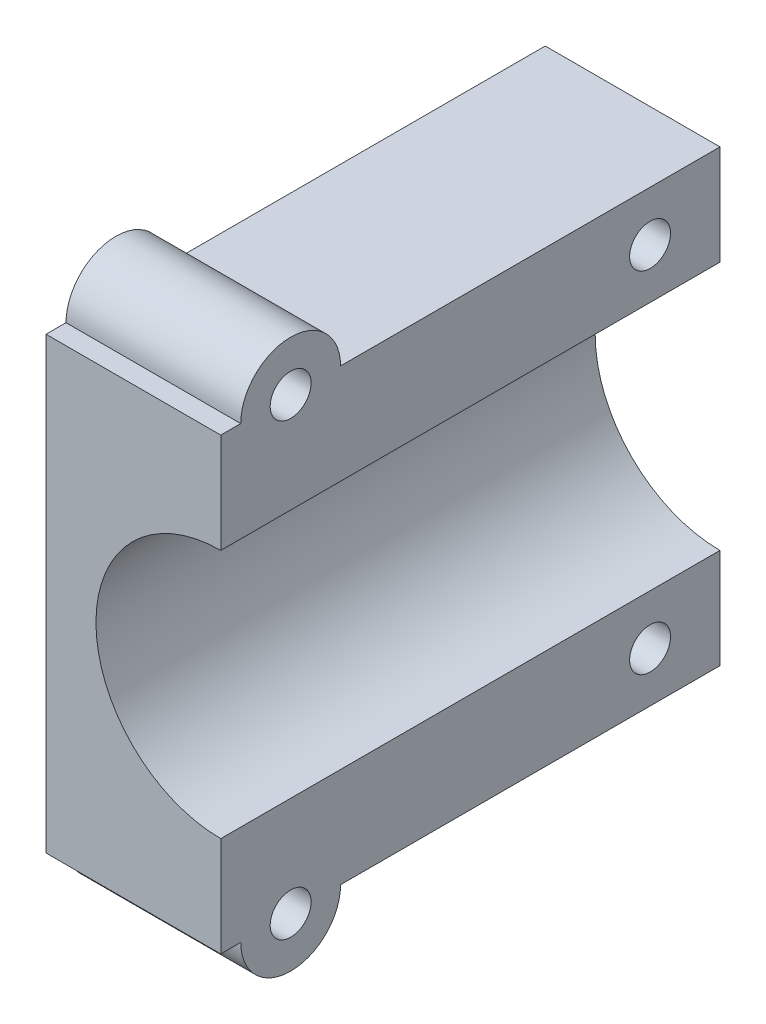
ISO-10303-21;
HEADER;
FILE_DESCRIPTION(('STEP AP214'),'2;1');
FILE_NAME('part.step','',(''),(''),'','','');
FILE_SCHEMA(('AUTOMOTIVE_DESIGN { 1 0 10303 214 1 1 1 1 }'));
ENDSEC;
DATA;
#1=APPLICATION_CONTEXT('core data for automotive mechanical design processes');
#2=APPLICATION_PROTOCOL_DEFINITION('international standard','automotive_design',2000,#1);
#3=PRODUCT_CONTEXT('',#1,'mechanical');
#4=PRODUCT('Part','Part','',(#3));
#5=PRODUCT_RELATED_PRODUCT_CATEGORY('part','',(#4));
#6=PRODUCT_DEFINITION_FORMATION('','',#4);
#7=PRODUCT_DEFINITION_CONTEXT('part definition',#1,'design');
#8=PRODUCT_DEFINITION('design','',#6,#7);
#9=PRODUCT_DEFINITION_SHAPE('','',#8);
#10=(LENGTH_UNIT() NAMED_UNIT(*) SI_UNIT(.MILLI.,.METRE.));
#11=(NAMED_UNIT(*) PLANE_ANGLE_UNIT() SI_UNIT($,.RADIAN.));
#12=(NAMED_UNIT(*) SI_UNIT($,.STERADIAN.) SOLID_ANGLE_UNIT());
#13=UNCERTAINTY_MEASURE_WITH_UNIT(LENGTH_MEASURE(1.E-05),#10,'distance_accuracy_value','');
#14=(GEOMETRIC_REPRESENTATION_CONTEXT(3) GLOBAL_UNCERTAINTY_ASSIGNED_CONTEXT((#13)) GLOBAL_UNIT_ASSIGNED_CONTEXT((#10,
#11,#12)) REPRESENTATION_CONTEXT('',''));
#15=CARTESIAN_POINT('',(0.,0.,0.));
#16=DIRECTION('',(0.,0.,1.));
#17=DIRECTION('',(1.,0.,0.));
#18=AXIS2_PLACEMENT_3D('',#15,#16,#17);
#19=CARTESIAN_POINT('',(-17.5,45.,25.));
#20=DIRECTION('',(0.,1.,0.));
#21=DIRECTION('',(0.,0.,1.));
#22=AXIS2_PLACEMENT_3D('',#19,#20,#21);
#23=PLANE('',#22);
#24=DIRECTION('',(0.,0.,-1.));
#25=VECTOR('',#24,1.);
#26=CARTESIAN_POINT('',(-17.5,45.,25.));
#27=LINE('',#26,#25);
#28=CARTESIAN_POINT('',(-17.5,45.,13.));
#29=VERTEX_POINT('',#28);
#30=CARTESIAN_POINT('',(-17.5,45.,-25.));
#31=VERTEX_POINT('',#30);
#32=EDGE_CURVE('E125',#29,#31,#27,.T.);
#33=ORIENTED_EDGE('',*,*,#32,.F.);
#34=DIRECTION('',(-1.,0.,0.));
#35=VECTOR('',#34,1.);
#36=CARTESIAN_POINT('',(0.,45.,13.));
#37=LINE('',#36,#35);
#38=CARTESIAN_POINT('',(0.,45.,13.));
#39=VERTEX_POINT('',#38);
#40=EDGE_CURVE('E112',#39,#29,#37,.T.);
#41=ORIENTED_EDGE('',*,*,#40,.F.);
#42=DIRECTION('',(0.,0.,1.));
#43=VECTOR('',#42,1.);
#44=CARTESIAN_POINT('',(0.,45.,-25.));
#45=LINE('',#44,#43);
#46=CARTESIAN_POINT('',(0.,45.,-25.));
#47=VERTEX_POINT('',#46);
#48=EDGE_CURVE('E123',#47,#39,#45,.T.);
#49=ORIENTED_EDGE('',*,*,#48,.F.);
#50=DIRECTION('',(1.,0.,0.));
#51=VECTOR('',#50,1.);
#52=CARTESIAN_POINT('',(-17.5,45.,-25.));
#53=LINE('',#52,#51);
#54=EDGE_CURVE('E154',#31,#47,#53,.T.);
#55=ORIENTED_EDGE('',*,*,#54,.F.);
#56=EDGE_LOOP('',(#33,#41,#49,#55));
#57=FACE_BOUND('',#56,.T.);
#58=ADVANCED_FACE('F34',(#57),#23,.T.);
#59=CARTESIAN_POINT('',(0.,45.,23.));
#60=VERTEX_POINT('',#59);
#61=CARTESIAN_POINT('',(0.,45.,25.));
#62=VERTEX_POINT('',#61);
#63=EDGE_CURVE('E131',#60,#62,#45,.T.);
#64=ORIENTED_EDGE('',*,*,#63,.F.);
#65=DIRECTION('',(-1.,0.,0.));
#66=VECTOR('',#65,1.);
#67=CARTESIAN_POINT('',(0.,45.,23.));
#68=LINE('',#67,#66);
#69=CARTESIAN_POINT('',(-17.5,45.,23.));
#70=VERTEX_POINT('',#69);
#71=EDGE_CURVE('E50',#60,#70,#68,.T.);
#72=ORIENTED_EDGE('',*,*,#71,.T.);
#73=CARTESIAN_POINT('',(-17.5,45.,25.));
#74=VERTEX_POINT('',#73);
#75=EDGE_CURVE('E159',#74,#70,#27,.T.);
#76=ORIENTED_EDGE('',*,*,#75,.F.);
#77=DIRECTION('',(1.,0.,0.));
#78=VECTOR('',#77,1.);
#79=CARTESIAN_POINT('',(-17.5,45.,25.));
#80=LINE('',#79,#78);
#81=EDGE_CURVE('E155',#74,#62,#80,.T.);
#82=ORIENTED_EDGE('',*,*,#81,.T.);
#83=EDGE_LOOP('',(#64,#72,#76,#82));
#84=FACE_BOUND('',#83,.T.);
#85=ADVANCED_FACE('F230',(#84),#23,.T.);
#86=CARTESIAN_POINT('',(-17.5,0.,25.));
#87=DIRECTION('',(0.,1.,0.));
#88=DIRECTION('',(0.,0.,1.));
#89=AXIS2_PLACEMENT_3D('',#86,#87,#88);
#90=PLANE('',#89);
#91=DIRECTION('',(0.,0.,-1.));
#92=VECTOR('',#91,1.);
#93=CARTESIAN_POINT('',(0.,0.,-25.));
#94=LINE('',#93,#92);
#95=CARTESIAN_POINT('',(0.,0.,13.));
#96=VERTEX_POINT('',#95);
#97=CARTESIAN_POINT('',(0.,0.,-25.));
#98=VERTEX_POINT('',#97);
#99=EDGE_CURVE('E130',#96,#98,#94,.T.);
#100=ORIENTED_EDGE('',*,*,#99,.F.);
#101=DIRECTION('',(-1.,0.,0.));
#102=VECTOR('',#101,1.);
#103=CARTESIAN_POINT('',(0.,0.,13.));
#104=LINE('',#103,#102);
#105=CARTESIAN_POINT('',(-17.5,0.,13.));
#106=VERTEX_POINT('',#105);
#107=EDGE_CURVE('E190',#96,#106,#104,.T.);
#108=ORIENTED_EDGE('',*,*,#107,.T.);
#109=DIRECTION('',(0.,0.,-1.));
#110=VECTOR('',#109,1.);
#111=CARTESIAN_POINT('',(-17.5,0.,25.));
#112=LINE('',#111,#110);
#113=CARTESIAN_POINT('',(-17.5,0.,-25.));
#114=VERTEX_POINT('',#113);
#115=EDGE_CURVE('E43',#106,#114,#112,.T.);
#116=ORIENTED_EDGE('',*,*,#115,.T.);
#117=DIRECTION('',(1.,0.,0.));
#118=VECTOR('',#117,1.);
#119=CARTESIAN_POINT('',(-17.5,0.,-25.));
#120=LINE('',#119,#118);
#121=EDGE_CURVE('E177',#114,#98,#120,.T.);
#122=ORIENTED_EDGE('',*,*,#121,.T.);
#123=EDGE_LOOP('',(#100,#108,#116,#122));
#124=FACE_BOUND('',#123,.T.);
#125=ADVANCED_FACE('F235',(#124),#90,.F.);
#126=CARTESIAN_POINT('',(-17.5,22.5,25.));
#127=DIRECTION('',(1.,0.,0.));
#128=DIRECTION('',(0.,0.,-1.));
#129=AXIS2_PLACEMENT_3D('',#126,#127,#128);
#130=PLANE('',#129);
#131=CARTESIAN_POINT('',(-17.5,45.,18.));
#132=DIRECTION('',(1.,0.,0.));
#133=DIRECTION('',(0.,1.,0.));
#134=AXIS2_PLACEMENT_3D('',#131,#132,#133);
#135=CIRCLE('',#134,2.05);
#136=CARTESIAN_POINT('',(-17.5,47.05,18.));
#137=VERTEX_POINT('',#136);
#138=EDGE_CURVE('E213',#137,#137,#135,.T.);
#139=ORIENTED_EDGE('',*,*,#138,.T.);
#140=EDGE_LOOP('',(#139));
#141=FACE_BOUND('',#140,.T.);
#142=CARTESIAN_POINT('',(-17.5,0.,18.));
#143=DIRECTION('',(-1.,0.,0.));
#144=DIRECTION('',(0.,-1.,0.));
#145=AXIS2_PLACEMENT_3D('',#142,#143,#144);
#146=CIRCLE('',#145,2.05);
#147=CARTESIAN_POINT('',(-17.5,-2.05,18.));
#148=VERTEX_POINT('',#147);
#149=EDGE_CURVE('E205',#148,#148,#146,.T.);
#150=ORIENTED_EDGE('',*,*,#149,.F.);
#151=EDGE_LOOP('',(#150));
#152=FACE_BOUND('',#151,.T.);
#153=CARTESIAN_POINT('',(-17.5,40.,-18.));
#154=DIRECTION('',(1.,0.,0.));
#155=DIRECTION('',(0.,0.,1.));
#156=AXIS2_PLACEMENT_3D('',#153,#154,#155);
#157=CIRCLE('',#156,2.05);
#158=CARTESIAN_POINT('',(-17.5,40.,-15.95));
#159=VERTEX_POINT('',#158);
#160=EDGE_CURVE('E151',#159,#159,#157,.T.);
#161=ORIENTED_EDGE('',*,*,#160,.T.);
#162=EDGE_LOOP('',(#161));
#163=FACE_BOUND('',#162,.T.);
#164=CARTESIAN_POINT('',(-17.5,5.,-18.));
#165=DIRECTION('',(-1.,0.,0.));
#166=DIRECTION('',(0.,0.,1.));
#167=AXIS2_PLACEMENT_3D('',#164,#165,#166);
#168=CIRCLE('',#167,2.05);
#169=CARTESIAN_POINT('',(-17.5,5.,-15.95));
#170=VERTEX_POINT('',#169);
#171=EDGE_CURVE('E162',#170,#170,#168,.T.);
#172=ORIENTED_EDGE('',*,*,#171,.F.);
#173=EDGE_LOOP('',(#172));
#174=FACE_BOUND('',#173,.T.);
#175=DIRECTION('',(0.,-1.,0.));
#176=VECTOR('',#175,1.);
#177=CARTESIAN_POINT('',(-17.5,22.5,-25.));
#178=LINE('',#177,#176);
#179=EDGE_CURVE('E165',#31,#114,#178,.T.);
#180=ORIENTED_EDGE('',*,*,#179,.T.);
#181=ORIENTED_EDGE('',*,*,#115,.F.);
#182=CARTESIAN_POINT('',(-17.5,0.,18.));
#183=DIRECTION('',(-1.,0.,0.));
#184=DIRECTION('',(0.,-1.,0.));
#185=AXIS2_PLACEMENT_3D('',#182,#183,#184);
#186=CIRCLE('',#185,5.);
#187=CARTESIAN_POINT('',(-17.5,0.,23.));
#188=VERTEX_POINT('',#187);
#189=EDGE_CURVE('E198',#106,#188,#186,.T.);
#190=ORIENTED_EDGE('',*,*,#189,.T.);
#191=CARTESIAN_POINT('',(-17.5,0.,25.));
#192=VERTEX_POINT('',#191);
#193=EDGE_CURVE('E11',#192,#188,#112,.T.);
#194=ORIENTED_EDGE('',*,*,#193,.F.);
#195=DIRECTION('',(0.,-1.,0.));
#196=VECTOR('',#195,1.);
#197=CARTESIAN_POINT('',(-17.5,22.5,25.));
#198=LINE('',#197,#196);
#199=EDGE_CURVE('E166',#74,#192,#198,.T.);
#200=ORIENTED_EDGE('',*,*,#199,.F.);
#201=ORIENTED_EDGE('',*,*,#75,.T.);
#202=CARTESIAN_POINT('',(-17.5,45.,18.));
#203=DIRECTION('',(1.,0.,0.));
#204=DIRECTION('',(0.,1.,0.));
#205=AXIS2_PLACEMENT_3D('',#202,#203,#204);
#206=CIRCLE('',#205,5.);
#207=EDGE_CURVE('E117',#29,#70,#206,.T.);
#208=ORIENTED_EDGE('',*,*,#207,.F.);
#209=ORIENTED_EDGE('',*,*,#32,.T.);
#210=EDGE_LOOP('',(#180,#181,#190,#194,#200,#201,#208,#209));
#211=FACE_BOUND('',#210,.T.);
#212=ADVANCED_FACE('F36',(#141,#152,#163,#174,#211),#130,.F.);
#213=ORIENTED_EDGE('',*,*,#193,.T.);
#214=DIRECTION('',(-1.,0.,0.));
#215=VECTOR('',#214,1.);
#216=CARTESIAN_POINT('',(0.,0.,23.));
#217=LINE('',#216,#215);
#218=CARTESIAN_POINT('',(0.,0.,23.));
#219=VERTEX_POINT('',#218);
#220=EDGE_CURVE('E192',#219,#188,#217,.T.);
#221=ORIENTED_EDGE('',*,*,#220,.F.);
#222=CARTESIAN_POINT('',(0.,0.,25.));
#223=VERTEX_POINT('',#222);
#224=EDGE_CURVE('E133',#223,#219,#94,.T.);
#225=ORIENTED_EDGE('',*,*,#224,.F.);
#226=DIRECTION('',(1.,0.,0.));
#227=VECTOR('',#226,1.);
#228=CARTESIAN_POINT('',(-17.5,0.,25.));
#229=LINE('',#228,#227);
#230=EDGE_CURVE('E168',#192,#223,#229,.T.);
#231=ORIENTED_EDGE('',*,*,#230,.F.);
#232=EDGE_LOOP('',(#213,#221,#225,#231));
#233=FACE_BOUND('',#232,.T.);
#234=ADVANCED_FACE('F252',(#233),#90,.F.);
#235=CARTESIAN_POINT('',(0.,22.5,25.));
#236=DIRECTION('',(0.,0.,-1.));
#237=DIRECTION('',(-1.,0.,0.));
#238=AXIS2_PLACEMENT_3D('',#235,#236,#237);
#239=CYLINDRICAL_SURFACE('',#238,12.5);
#240=CARTESIAN_POINT('',(0.,22.5,-25.));
#241=DIRECTION('',(0.,0.,-1.));
#242=DIRECTION('',(1.,0.,0.));
#243=AXIS2_PLACEMENT_3D('',#240,#241,#242);
#244=CIRCLE('',#243,12.5);
#245=CARTESIAN_POINT('',(0.,10.,-25.));
#246=VERTEX_POINT('',#245);
#247=CARTESIAN_POINT('',(0.,35.,-25.));
#248=VERTEX_POINT('',#247);
#249=EDGE_CURVE('E169',#246,#248,#244,.T.);
#250=ORIENTED_EDGE('',*,*,#249,.T.);
#251=DIRECTION('',(0.,0.,-1.));
#252=VECTOR('',#251,1.);
#253=CARTESIAN_POINT('',(0.,35.,25.));
#254=LINE('',#253,#252);
#255=CARTESIAN_POINT('',(0.,35.,25.));
#256=VERTEX_POINT('',#255);
#257=EDGE_CURVE('E148',#248,#256,#254,.F.);
#258=ORIENTED_EDGE('',*,*,#257,.T.);
#259=CARTESIAN_POINT('',(0.,22.5,25.));
#260=DIRECTION('',(0.,0.,-1.));
#261=DIRECTION('',(1.,0.,0.));
#262=AXIS2_PLACEMENT_3D('',#259,#260,#261);
#263=CIRCLE('',#262,12.5);
#264=CARTESIAN_POINT('',(0.,10.,25.));
#265=VERTEX_POINT('',#264);
#266=EDGE_CURVE('E172',#265,#256,#263,.T.);
#267=ORIENTED_EDGE('',*,*,#266,.F.);
#268=DIRECTION('',(0.,0.,-1.));
#269=VECTOR('',#268,1.);
#270=CARTESIAN_POINT('',(0.,10.,25.));
#271=LINE('',#270,#269);
#272=EDGE_CURVE('E144',#265,#246,#271,.T.);
#273=ORIENTED_EDGE('',*,*,#272,.T.);
#274=EDGE_LOOP('',(#250,#258,#267,#273));
#275=FACE_BOUND('',#274,.T.);
#276=ADVANCED_FACE('F183',(#275),#239,.F.);
#277=CARTESIAN_POINT('',(0.,22.5,25.));
#278=DIRECTION('',(0.,0.,1.));
#279=DIRECTION('',(1.,0.,0.));
#280=AXIS2_PLACEMENT_3D('',#277,#278,#279);
#281=PLANE('',#280);
#282=DIRECTION('',(0.,-1.,0.));
#283=VECTOR('',#282,1.);
#284=CARTESIAN_POINT('',(0.,22.5,25.));
#285=LINE('',#284,#283);
#286=EDGE_CURVE('E145',#62,#256,#285,.T.);
#287=ORIENTED_EDGE('',*,*,#286,.F.);
#288=ORIENTED_EDGE('',*,*,#81,.F.);
#289=ORIENTED_EDGE('',*,*,#199,.T.);
#290=ORIENTED_EDGE('',*,*,#230,.T.);
#291=EDGE_CURVE('E142',#265,#223,#285,.T.);
#292=ORIENTED_EDGE('',*,*,#291,.F.);
#293=ORIENTED_EDGE('',*,*,#266,.T.);
#294=EDGE_LOOP('',(#287,#288,#289,#290,#292,#293));
#295=FACE_BOUND('',#294,.T.);
#296=ADVANCED_FACE('F245',(#295),#281,.T.);
#297=CARTESIAN_POINT('',(0.,22.5,-25.));
#298=DIRECTION('',(0.,0.,1.));
#299=DIRECTION('',(1.,0.,0.));
#300=AXIS2_PLACEMENT_3D('',#297,#298,#299);
#301=PLANE('',#300);
#302=ORIENTED_EDGE('',*,*,#54,.T.);
#303=DIRECTION('',(0.,1.,0.));
#304=VECTOR('',#303,1.);
#305=CARTESIAN_POINT('',(0.,45.,-25.));
#306=LINE('',#305,#304);
#307=EDGE_CURVE('E129',#248,#47,#306,.T.);
#308=ORIENTED_EDGE('',*,*,#307,.F.);
#309=ORIENTED_EDGE('',*,*,#249,.F.);
#310=EDGE_CURVE('E135',#98,#246,#306,.T.);
#311=ORIENTED_EDGE('',*,*,#310,.F.);
#312=ORIENTED_EDGE('',*,*,#121,.F.);
#313=ORIENTED_EDGE('',*,*,#179,.F.);
#314=EDGE_LOOP('',(#302,#308,#309,#311,#312,#313));
#315=FACE_BOUND('',#314,.T.);
#316=ADVANCED_FACE('F187',(#315),#301,.F.);
#317=CARTESIAN_POINT('',(23.2982756057297,5.,-18.));
#318=DIRECTION('',(-1.,0.,0.));
#319=DIRECTION('',(0.,0.,1.));
#320=AXIS2_PLACEMENT_3D('',#317,#318,#319);
#321=CYLINDRICAL_SURFACE('',#320,2.05);
#322=CARTESIAN_POINT('',(0.,5.,-18.));
#323=DIRECTION('',(-1.,0.,0.));
#324=DIRECTION('',(0.,0.,1.));
#325=AXIS2_PLACEMENT_3D('',#322,#323,#324);
#326=CIRCLE('',#325,2.05);
#327=CARTESIAN_POINT('',(0.,5.,-15.95));
#328=VERTEX_POINT('',#327);
#329=EDGE_CURVE('E139',#328,#328,#326,.F.);
#330=ORIENTED_EDGE('',*,*,#329,.T.);
#331=EDGE_LOOP('',(#330));
#332=FACE_BOUND('',#331,.T.);
#333=ORIENTED_EDGE('',*,*,#171,.T.);
#334=EDGE_LOOP('',(#333));
#335=FACE_BOUND('',#334,.T.);
#336=ADVANCED_FACE('F241',(#332,#335),#321,.F.);
#337=CARTESIAN_POINT('',(23.2982756057297,40.,-18.));
#338=DIRECTION('',(-1.,0.,0.));
#339=DIRECTION('',(0.,0.,1.));
#340=AXIS2_PLACEMENT_3D('',#337,#338,#339);
#341=CYLINDRICAL_SURFACE('',#340,2.05);
#342=CARTESIAN_POINT('',(0.,40.,-18.));
#343=DIRECTION('',(-1.,0.,0.));
#344=DIRECTION('',(0.,0.,1.));
#345=AXIS2_PLACEMENT_3D('',#342,#343,#344);
#346=CIRCLE('',#345,2.05);
#347=CARTESIAN_POINT('',(0.,40.,-15.95));
#348=VERTEX_POINT('',#347);
#349=EDGE_CURVE('E38',#348,#348,#346,.T.);
#350=ORIENTED_EDGE('',*,*,#349,.F.);
#351=EDGE_LOOP('',(#350));
#352=FACE_BOUND('',#351,.T.);
#353=ORIENTED_EDGE('',*,*,#160,.F.);
#354=EDGE_LOOP('',(#353));
#355=FACE_BOUND('',#354,.T.);
#356=ADVANCED_FACE('F239',(#352,#355),#341,.F.);
#357=CARTESIAN_POINT('',(0.,0.,0.));
#358=DIRECTION('',(-1.,0.,0.));
#359=DIRECTION('',(0.,0.,1.));
#360=AXIS2_PLACEMENT_3D('',#357,#358,#359);
#361=PLANE('',#360);
#362=CARTESIAN_POINT('',(0.,45.,18.));
#363=DIRECTION('',(-1.,0.,0.));
#364=DIRECTION('',(0.,0.,1.));
#365=AXIS2_PLACEMENT_3D('',#362,#363,#364);
#366=CIRCLE('',#365,2.05);
#367=CARTESIAN_POINT('',(0.,45.,20.05));
#368=VERTEX_POINT('',#367);
#369=EDGE_CURVE('E209',#368,#368,#366,.T.);
#370=ORIENTED_EDGE('',*,*,#369,.T.);
#371=EDGE_LOOP('',(#370));
#372=FACE_BOUND('',#371,.T.);
#373=ORIENTED_EDGE('',*,*,#349,.T.);
#374=EDGE_LOOP('',(#373));
#375=FACE_BOUND('',#374,.T.);
#376=ORIENTED_EDGE('',*,*,#307,.T.);
#377=ORIENTED_EDGE('',*,*,#48,.T.);
#378=CARTESIAN_POINT('',(0.,45.,18.));
#379=DIRECTION('',(1.,0.,0.));
#380=DIRECTION('',(0.,1.,0.));
#381=AXIS2_PLACEMENT_3D('',#378,#379,#380);
#382=CIRCLE('',#381,5.);
#383=EDGE_CURVE('E109',#39,#60,#382,.T.);
#384=ORIENTED_EDGE('',*,*,#383,.T.);
#385=ORIENTED_EDGE('',*,*,#63,.T.);
#386=ORIENTED_EDGE('',*,*,#286,.T.);
#387=ORIENTED_EDGE('',*,*,#257,.F.);
#388=EDGE_LOOP('',(#376,#377,#384,#385,#386,#387));
#389=FACE_BOUND('',#388,.T.);
#390=ADVANCED_FACE('F127',(#372,#375,#389),#361,.F.);
#391=CARTESIAN_POINT('',(0.,0.,18.));
#392=DIRECTION('',(-1.,0.,0.));
#393=DIRECTION('',(0.,0.,1.));
#394=AXIS2_PLACEMENT_3D('',#391,#392,#393);
#395=CIRCLE('',#394,2.05);
#396=CARTESIAN_POINT('',(0.,0.,20.05));
#397=VERTEX_POINT('',#396);
#398=EDGE_CURVE('E201',#397,#397,#395,.F.);
#399=ORIENTED_EDGE('',*,*,#398,.F.);
#400=EDGE_LOOP('',(#399));
#401=FACE_BOUND('',#400,.T.);
#402=ORIENTED_EDGE('',*,*,#329,.F.);
#403=EDGE_LOOP('',(#402));
#404=FACE_BOUND('',#403,.T.);
#405=ORIENTED_EDGE('',*,*,#291,.T.);
#406=ORIENTED_EDGE('',*,*,#224,.T.);
#407=CARTESIAN_POINT('',(0.,0.,18.));
#408=DIRECTION('',(-1.,0.,0.));
#409=DIRECTION('',(0.,-1.,0.));
#410=AXIS2_PLACEMENT_3D('',#407,#408,#409);
#411=CIRCLE('',#410,5.);
#412=EDGE_CURVE('E58',#96,#219,#411,.T.);
#413=ORIENTED_EDGE('',*,*,#412,.F.);
#414=ORIENTED_EDGE('',*,*,#99,.T.);
#415=ORIENTED_EDGE('',*,*,#310,.T.);
#416=ORIENTED_EDGE('',*,*,#272,.F.);
#417=EDGE_LOOP('',(#405,#406,#413,#414,#415,#416));
#418=FACE_BOUND('',#417,.T.);
#419=ADVANCED_FACE('F261',(#401,#404,#418),#361,.F.);
#420=CARTESIAN_POINT('',(0.,0.,18.));
#421=DIRECTION('',(-1.,0.,0.));
#422=DIRECTION('',(0.,-1.,0.));
#423=AXIS2_PLACEMENT_3D('',#420,#421,#422);
#424=CYLINDRICAL_SURFACE('',#423,5.);
#425=ORIENTED_EDGE('',*,*,#189,.F.);
#426=ORIENTED_EDGE('',*,*,#107,.F.);
#427=ORIENTED_EDGE('',*,*,#412,.T.);
#428=ORIENTED_EDGE('',*,*,#220,.T.);
#429=EDGE_LOOP('',(#425,#426,#427,#428));
#430=FACE_BOUND('',#429,.T.);
#431=ADVANCED_FACE('F282',(#430),#424,.T.);
#432=CARTESIAN_POINT('',(5.79827560572969,0.,18.));
#433=DIRECTION('',(-1.,0.,0.));
#434=DIRECTION('',(0.,-1.,0.));
#435=AXIS2_PLACEMENT_3D('',#432,#433,#434);
#436=CYLINDRICAL_SURFACE('',#435,2.05);
#437=ORIENTED_EDGE('',*,*,#398,.T.);
#438=EDGE_LOOP('',(#437));
#439=FACE_BOUND('',#438,.T.);
#440=ORIENTED_EDGE('',*,*,#149,.T.);
#441=EDGE_LOOP('',(#440));
#442=FACE_BOUND('',#441,.T.);
#443=ADVANCED_FACE('F226',(#439,#442),#436,.F.);
#444=CARTESIAN_POINT('',(0.,45.,18.));
#445=DIRECTION('',(-1.,0.,0.));
#446=DIRECTION('',(0.,-1.,0.));
#447=AXIS2_PLACEMENT_3D('',#444,#445,#446);
#448=CYLINDRICAL_SURFACE('',#447,5.);
#449=ORIENTED_EDGE('',*,*,#207,.T.);
#450=ORIENTED_EDGE('',*,*,#71,.F.);
#451=ORIENTED_EDGE('',*,*,#383,.F.);
#452=ORIENTED_EDGE('',*,*,#40,.T.);
#453=EDGE_LOOP('',(#449,#450,#451,#452));
#454=FACE_BOUND('',#453,.T.);
#455=ADVANCED_FACE('F111',(#454),#448,.T.);
#456=CARTESIAN_POINT('',(5.79827560572969,45.,18.));
#457=DIRECTION('',(-1.,0.,0.));
#458=DIRECTION('',(0.,-1.,0.));
#459=AXIS2_PLACEMENT_3D('',#456,#457,#458);
#460=CYLINDRICAL_SURFACE('',#459,2.05);
#461=ORIENTED_EDGE('',*,*,#369,.F.);
#462=EDGE_LOOP('',(#461));
#463=FACE_BOUND('',#462,.T.);
#464=ORIENTED_EDGE('',*,*,#138,.F.);
#465=EDGE_LOOP('',(#464));
#466=FACE_BOUND('',#465,.T.);
#467=ADVANCED_FACE('F219',(#463,#466),#460,.F.);
#468=CLOSED_SHELL('',(#58,#85,#125,#212,#234,#276,#296,#316,#336,#356,#390,#419,#431,#443,#455,#467));
#469=MANIFOLD_SOLID_BREP('B2',#468);
#470=ADVANCED_BREP_SHAPE_REPRESENTATION('',(#18,#469),#14);
#471=SHAPE_DEFINITION_REPRESENTATION(#9,#470);
ENDSEC;
END-ISO-10303-21;
